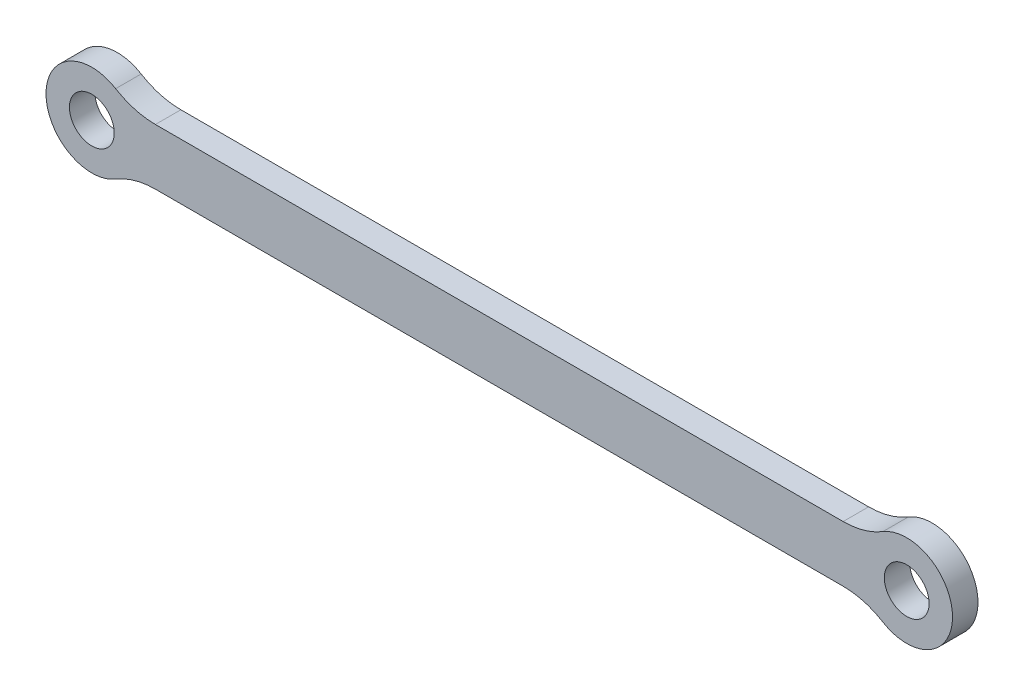
ISO-10303-21;
HEADER;
FILE_DESCRIPTION(('STEP AP214'),'2;1');
FILE_NAME('part.step','',(''),(''),'','','');
FILE_SCHEMA(('AUTOMOTIVE_DESIGN { 1 0 10303 214 1 1 1 1 }'));
ENDSEC;
DATA;
#1=APPLICATION_CONTEXT('core data for automotive mechanical design processes');
#2=APPLICATION_PROTOCOL_DEFINITION('international standard','automotive_design',2000,#1);
#3=PRODUCT_CONTEXT('',#1,'mechanical');
#4=PRODUCT('Part','Part','',(#3));
#5=PRODUCT_RELATED_PRODUCT_CATEGORY('part','',(#4));
#6=PRODUCT_DEFINITION_FORMATION('','',#4);
#7=PRODUCT_DEFINITION_CONTEXT('part definition',#1,'design');
#8=PRODUCT_DEFINITION('design','',#6,#7);
#9=PRODUCT_DEFINITION_SHAPE('','',#8);
#10=(LENGTH_UNIT() NAMED_UNIT(*) SI_UNIT(.MILLI.,.METRE.));
#11=(NAMED_UNIT(*) PLANE_ANGLE_UNIT() SI_UNIT($,.RADIAN.));
#12=(NAMED_UNIT(*) SI_UNIT($,.STERADIAN.) SOLID_ANGLE_UNIT());
#13=UNCERTAINTY_MEASURE_WITH_UNIT(LENGTH_MEASURE(1.E-05),#10,'distance_accuracy_value','');
#14=(GEOMETRIC_REPRESENTATION_CONTEXT(3) GLOBAL_UNCERTAINTY_ASSIGNED_CONTEXT((#13)) GLOBAL_UNIT_ASSIGNED_CONTEXT((#10,
#11,#12)) REPRESENTATION_CONTEXT('',''));
#15=CARTESIAN_POINT('',(0.,0.,0.));
#16=DIRECTION('',(0.,0.,1.));
#17=DIRECTION('',(1.,0.,0.));
#18=AXIS2_PLACEMENT_3D('',#15,#16,#17);
#19=CARTESIAN_POINT('',(-160.,0.,5.));
#20=DIRECTION('',(0.,0.,1.));
#21=DIRECTION('',(1.,0.,0.));
#22=AXIS2_PLACEMENT_3D('',#19,#20,#21);
#23=PLANE('',#22);
#24=CARTESIAN_POINT('',(0.,0.,5.));
#25=DIRECTION('',(0.,0.,-1.));
#26=DIRECTION('',(-1.,0.,0.));
#27=AXIS2_PLACEMENT_3D('',#24,#25,#26);
#28=CIRCLE('',#27,4.4);
#29=CARTESIAN_POINT('',(-4.4,0.,5.));
#30=VERTEX_POINT('',#29);
#31=EDGE_CURVE('E130',#30,#30,#28,.T.);
#32=ORIENTED_EDGE('',*,*,#31,.T.);
#33=EDGE_LOOP('',(#32));
#34=FACE_BOUND('',#33,.T.);
#35=CARTESIAN_POINT('',(0.,0.,5.));
#36=DIRECTION('',(0.,0.,-1.));
#37=DIRECTION('',(-1.,0.,0.));
#38=AXIS2_PLACEMENT_3D('',#35,#36,#37);
#39=CIRCLE('',#38,9.);
#40=CARTESIAN_POINT('',(-4.67999399038076,7.68749999999999,5.));
#41=VERTEX_POINT('',#40);
#42=CARTESIAN_POINT('',(-4.67999399038075,-7.68750000000001,5.));
#43=VERTEX_POINT('',#42);
#44=EDGE_CURVE('E137',#41,#43,#39,.T.);
#45=ORIENTED_EDGE('',*,*,#44,.F.);
#46=CARTESIAN_POINT('',(-12.4799839743487,20.5,5.));
#47=DIRECTION('',(0.,0.,-1.));
#48=DIRECTION('',(-1.,0.,0.));
#49=AXIS2_PLACEMENT_3D('',#46,#47,#48);
#50=CIRCLE('',#49,15.);
#51=CARTESIAN_POINT('',(-12.4799839743487,5.49999999999998,5.));
#52=VERTEX_POINT('',#51);
#53=EDGE_CURVE('E134',#41,#52,#50,.T.);
#54=ORIENTED_EDGE('',*,*,#53,.T.);
#55=DIRECTION('',(1.,0.,0.));
#56=VECTOR('',#55,1.);
#57=CARTESIAN_POINT('',(-152.876096575612,5.49999999999998,5.));
#58=LINE('',#57,#56);
#59=CARTESIAN_POINT('',(-147.520016025651,5.49999999999999,5.));
#60=VERTEX_POINT('',#59);
#61=EDGE_CURVE('E104',#52,#60,#58,.F.);
#62=ORIENTED_EDGE('',*,*,#61,.T.);
#63=CARTESIAN_POINT('',(-147.520016025651,20.5,5.));
#64=DIRECTION('',(0.,0.,-1.));
#65=DIRECTION('',(-1.,0.,0.));
#66=AXIS2_PLACEMENT_3D('',#63,#64,#65);
#67=CIRCLE('',#66,15.);
#68=CARTESIAN_POINT('',(-155.320006009619,7.68749999999999,5.));
#69=VERTEX_POINT('',#68);
#70=EDGE_CURVE('E86',#60,#69,#67,.T.);
#71=ORIENTED_EDGE('',*,*,#70,.T.);
#72=CARTESIAN_POINT('',(-160.,0.,5.));
#73=DIRECTION('',(0.,0.,-1.));
#74=DIRECTION('',(-1.,0.,0.));
#75=AXIS2_PLACEMENT_3D('',#72,#73,#74);
#76=CIRCLE('',#75,9.00000000000001);
#77=CARTESIAN_POINT('',(-155.320006009619,-7.68750000000001,5.));
#78=VERTEX_POINT('',#77);
#79=EDGE_CURVE('E83',#78,#69,#76,.T.);
#80=ORIENTED_EDGE('',*,*,#79,.F.);
#81=CARTESIAN_POINT('',(-147.520016025651,-20.5,5.));
#82=DIRECTION('',(0.,0.,-1.));
#83=DIRECTION('',(-1.,0.,0.));
#84=AXIS2_PLACEMENT_3D('',#81,#82,#83);
#85=CIRCLE('',#84,15.);
#86=CARTESIAN_POINT('',(-147.520016025651,-5.50000000000002,5.));
#87=VERTEX_POINT('',#86);
#88=EDGE_CURVE('E80',#78,#87,#85,.T.);
#89=ORIENTED_EDGE('',*,*,#88,.T.);
#90=DIRECTION('',(1.,0.,0.));
#91=VECTOR('',#90,1.);
#92=CARTESIAN_POINT('',(-152.876096575612,-5.50000000000002,5.));
#93=LINE('',#92,#91);
#94=CARTESIAN_POINT('',(-12.4799839743487,-5.50000000000002,5.));
#95=VERTEX_POINT('',#94);
#96=EDGE_CURVE('E108',#87,#95,#93,.T.);
#97=ORIENTED_EDGE('',*,*,#96,.T.);
#98=CARTESIAN_POINT('',(-12.4799839743487,-20.5,5.));
#99=DIRECTION('',(0.,0.,-1.));
#100=DIRECTION('',(-1.,0.,0.));
#101=AXIS2_PLACEMENT_3D('',#98,#99,#100);
#102=CIRCLE('',#101,15.);
#103=EDGE_CURVE('E140',#95,#43,#102,.T.);
#104=ORIENTED_EDGE('',*,*,#103,.T.);
#105=EDGE_LOOP('',(#45,#54,#62,#71,#80,#89,#97,#104));
#106=FACE_BOUND('',#105,.T.);
#107=CARTESIAN_POINT('',(-160.,0.,5.));
#108=DIRECTION('',(0.,0.,-1.));
#109=DIRECTION('',(-1.,0.,0.));
#110=AXIS2_PLACEMENT_3D('',#107,#108,#109);
#111=CIRCLE('',#110,4.39999999999999);
#112=CARTESIAN_POINT('',(-164.4,0.,5.));
#113=VERTEX_POINT('',#112);
#114=EDGE_CURVE('E20',#113,#113,#111,.T.);
#115=ORIENTED_EDGE('',*,*,#114,.T.);
#116=EDGE_LOOP('',(#115));
#117=FACE_BOUND('',#116,.T.);
#118=ADVANCED_FACE('F17',(#34,#106,#117),#23,.T.);
#119=CARTESIAN_POINT('',(-160.,0.,5.));
#120=DIRECTION('',(0.,0.,-1.));
#121=DIRECTION('',(-1.,0.,0.));
#122=AXIS2_PLACEMENT_3D('',#119,#120,#121);
#123=CYLINDRICAL_SURFACE('',#122,4.39999999999999);
#124=CARTESIAN_POINT('',(-160.,0.,0.));
#125=DIRECTION('',(0.,0.,-1.));
#126=DIRECTION('',(-1.,0.,0.));
#127=AXIS2_PLACEMENT_3D('',#124,#125,#126);
#128=CIRCLE('',#127,4.39999999999999);
#129=CARTESIAN_POINT('',(-164.4,0.,0.));
#130=VERTEX_POINT('',#129);
#131=EDGE_CURVE('E127',#130,#130,#128,.T.);
#132=ORIENTED_EDGE('',*,*,#131,.T.);
#133=EDGE_LOOP('',(#132));
#134=FACE_BOUND('',#133,.T.);
#135=ORIENTED_EDGE('',*,*,#114,.F.);
#136=EDGE_LOOP('',(#135));
#137=FACE_BOUND('',#136,.T.);
#138=ADVANCED_FACE('F267',(#134,#137),#123,.F.);
#139=CARTESIAN_POINT('',(-147.520016025651,-20.5,5.));
#140=DIRECTION('',(0.,0.,-1.));
#141=DIRECTION('',(-1.,0.,0.));
#142=AXIS2_PLACEMENT_3D('',#139,#140,#141);
#143=CYLINDRICAL_SURFACE('',#142,15.);
#144=DIRECTION('',(0.,0.,-1.));
#145=VECTOR('',#144,1.);
#146=CARTESIAN_POINT('',(-155.320006009619,-7.68749999999999,5.));
#147=LINE('',#146,#145);
#148=CARTESIAN_POINT('',(-155.320006009619,-7.6875,0.));
#149=VERTEX_POINT('',#148);
#150=EDGE_CURVE('E96',#149,#78,#147,.F.);
#151=ORIENTED_EDGE('',*,*,#150,.F.);
#152=CARTESIAN_POINT('',(-147.520016025651,-20.5,0.));
#153=DIRECTION('',(0.,0.,-1.));
#154=DIRECTION('',(-1.,0.,0.));
#155=AXIS2_PLACEMENT_3D('',#152,#153,#154);
#156=CIRCLE('',#155,15.);
#157=CARTESIAN_POINT('',(-147.520016025651,-5.50000000000002,0.));
#158=VERTEX_POINT('',#157);
#159=EDGE_CURVE('E124',#149,#158,#156,.T.);
#160=ORIENTED_EDGE('',*,*,#159,.T.);
#161=DIRECTION('',(0.,0.,1.));
#162=VECTOR('',#161,1.);
#163=CARTESIAN_POINT('',(-147.520016025651,-5.50000000000002,5.));
#164=LINE('',#163,#162);
#165=EDGE_CURVE('E97',#158,#87,#164,.T.);
#166=ORIENTED_EDGE('',*,*,#165,.T.);
#167=ORIENTED_EDGE('',*,*,#88,.F.);
#168=EDGE_LOOP('',(#151,#160,#166,#167));
#169=FACE_BOUND('',#168,.T.);
#170=ADVANCED_FACE('F94',(#169),#143,.F.);
#171=CARTESIAN_POINT('',(-152.876096575612,-5.50000000000002,5.));
#172=DIRECTION('',(0.,1.,0.));
#173=DIRECTION('',(0.,0.,1.));
#174=AXIS2_PLACEMENT_3D('',#171,#172,#173);
#175=PLANE('',#174);
#176=ORIENTED_EDGE('',*,*,#165,.F.);
#177=DIRECTION('',(1.,0.,0.));
#178=VECTOR('',#177,1.);
#179=CARTESIAN_POINT('',(-160.,-5.50000000000002,0.));
#180=LINE('',#179,#178);
#181=CARTESIAN_POINT('',(-12.4799839743487,-5.50000000000002,0.));
#182=VERTEX_POINT('',#181);
#183=EDGE_CURVE('E123',#158,#182,#180,.T.);
#184=ORIENTED_EDGE('',*,*,#183,.T.);
#185=DIRECTION('',(0.,0.,-1.));
#186=VECTOR('',#185,1.);
#187=CARTESIAN_POINT('',(-12.4799839743487,-5.50000000000002,5.));
#188=LINE('',#187,#186);
#189=EDGE_CURVE('E109',#182,#95,#188,.F.);
#190=ORIENTED_EDGE('',*,*,#189,.T.);
#191=ORIENTED_EDGE('',*,*,#96,.F.);
#192=EDGE_LOOP('',(#176,#184,#190,#191));
#193=FACE_BOUND('',#192,.T.);
#194=ADVANCED_FACE('F176',(#193),#175,.F.);
#195=CARTESIAN_POINT('',(-12.4799839743487,-20.5,5.));
#196=DIRECTION('',(0.,0.,-1.));
#197=DIRECTION('',(-1.,0.,0.));
#198=AXIS2_PLACEMENT_3D('',#195,#196,#197);
#199=CYLINDRICAL_SURFACE('',#198,15.);
#200=ORIENTED_EDGE('',*,*,#189,.F.);
#201=CARTESIAN_POINT('',(-12.4799839743487,-20.5,0.));
#202=DIRECTION('',(0.,0.,-1.));
#203=DIRECTION('',(-1.,0.,0.));
#204=AXIS2_PLACEMENT_3D('',#201,#202,#203);
#205=CIRCLE('',#204,15.);
#206=CARTESIAN_POINT('',(-4.67999399038075,-7.68750000000001,0.));
#207=VERTEX_POINT('',#206);
#208=EDGE_CURVE('E120',#182,#207,#205,.T.);
#209=ORIENTED_EDGE('',*,*,#208,.T.);
#210=DIRECTION('',(0.,0.,-1.));
#211=VECTOR('',#210,1.);
#212=CARTESIAN_POINT('',(-4.67999399038075,-7.68750000000001,5.));
#213=LINE('',#212,#211);
#214=EDGE_CURVE('E139',#43,#207,#213,.T.);
#215=ORIENTED_EDGE('',*,*,#214,.F.);
#216=ORIENTED_EDGE('',*,*,#103,.F.);
#217=EDGE_LOOP('',(#200,#209,#215,#216));
#218=FACE_BOUND('',#217,.T.);
#219=ADVANCED_FACE('F174',(#218),#199,.F.);
#220=CARTESIAN_POINT('',(0.,0.,5.));
#221=DIRECTION('',(0.,0.,-1.));
#222=DIRECTION('',(-1.,0.,0.));
#223=AXIS2_PLACEMENT_3D('',#220,#221,#222);
#224=CYLINDRICAL_SURFACE('',#223,9.);
#225=CARTESIAN_POINT('',(0.,0.,0.));
#226=DIRECTION('',(0.,0.,-1.));
#227=DIRECTION('',(-1.,0.,0.));
#228=AXIS2_PLACEMENT_3D('',#225,#226,#227);
#229=CIRCLE('',#228,9.);
#230=CARTESIAN_POINT('',(-4.67999399038076,7.68749999999999,0.));
#231=VERTEX_POINT('',#230);
#232=EDGE_CURVE('E117',#207,#231,#229,.F.);
#233=ORIENTED_EDGE('',*,*,#232,.T.);
#234=DIRECTION('',(0.,0.,-1.));
#235=VECTOR('',#234,1.);
#236=CARTESIAN_POINT('',(-4.67999399038076,7.6875,5.));
#237=LINE('',#236,#235);
#238=EDGE_CURVE('E136',#231,#41,#237,.F.);
#239=ORIENTED_EDGE('',*,*,#238,.T.);
#240=ORIENTED_EDGE('',*,*,#44,.T.);
#241=ORIENTED_EDGE('',*,*,#214,.T.);
#242=EDGE_LOOP('',(#233,#239,#240,#241));
#243=FACE_BOUND('',#242,.T.);
#244=ADVANCED_FACE('F170',(#243),#224,.T.);
#245=CARTESIAN_POINT('',(-12.4799839743487,20.5,5.));
#246=DIRECTION('',(0.,0.,-1.));
#247=DIRECTION('',(-1.,0.,0.));
#248=AXIS2_PLACEMENT_3D('',#245,#246,#247);
#249=CYLINDRICAL_SURFACE('',#248,15.);
#250=ORIENTED_EDGE('',*,*,#238,.F.);
#251=CARTESIAN_POINT('',(-12.4799839743487,20.5,0.));
#252=DIRECTION('',(0.,0.,-1.));
#253=DIRECTION('',(-1.,0.,0.));
#254=AXIS2_PLACEMENT_3D('',#251,#252,#253);
#255=CIRCLE('',#254,15.);
#256=CARTESIAN_POINT('',(-12.4799839743487,5.49999999999998,0.));
#257=VERTEX_POINT('',#256);
#258=EDGE_CURVE('E114',#231,#257,#255,.T.);
#259=ORIENTED_EDGE('',*,*,#258,.T.);
#260=DIRECTION('',(0.,0.,-1.));
#261=VECTOR('',#260,1.);
#262=CARTESIAN_POINT('',(-12.4799839743487,5.49999999999998,5.));
#263=LINE('',#262,#261);
#264=EDGE_CURVE('E107',#257,#52,#263,.F.);
#265=ORIENTED_EDGE('',*,*,#264,.T.);
#266=ORIENTED_EDGE('',*,*,#53,.F.);
#267=EDGE_LOOP('',(#250,#259,#265,#266));
#268=FACE_BOUND('',#267,.T.);
#269=ADVANCED_FACE('F167',(#268),#249,.F.);
#270=CARTESIAN_POINT('',(-152.876096575612,5.49999999999998,5.));
#271=DIRECTION('',(0.,-1.,0.));
#272=DIRECTION('',(0.,0.,-1.));
#273=AXIS2_PLACEMENT_3D('',#270,#271,#272);
#274=PLANE('',#273);
#275=DIRECTION('',(0.,0.,-1.));
#276=VECTOR('',#275,1.);
#277=CARTESIAN_POINT('',(-147.520016025651,5.49999999999999,5.));
#278=LINE('',#277,#276);
#279=CARTESIAN_POINT('',(-147.520016025651,5.49999999999999,0.));
#280=VERTEX_POINT('',#279);
#281=EDGE_CURVE('E106',#280,#60,#278,.F.);
#282=ORIENTED_EDGE('',*,*,#281,.T.);
#283=ORIENTED_EDGE('',*,*,#61,.F.);
#284=ORIENTED_EDGE('',*,*,#264,.F.);
#285=DIRECTION('',(1.,0.,0.));
#286=VECTOR('',#285,1.);
#287=CARTESIAN_POINT('',(-160.,5.49999999999998,0.));
#288=LINE('',#287,#286);
#289=EDGE_CURVE('E113',#257,#280,#288,.F.);
#290=ORIENTED_EDGE('',*,*,#289,.T.);
#291=EDGE_LOOP('',(#282,#283,#284,#290));
#292=FACE_BOUND('',#291,.T.);
#293=ADVANCED_FACE('F160',(#292),#274,.F.);
#294=CARTESIAN_POINT('',(-147.520016025651,20.5,5.));
#295=DIRECTION('',(0.,0.,-1.));
#296=DIRECTION('',(-1.,0.,0.));
#297=AXIS2_PLACEMENT_3D('',#294,#295,#296);
#298=CYLINDRICAL_SURFACE('',#297,15.);
#299=ORIENTED_EDGE('',*,*,#281,.F.);
#300=CARTESIAN_POINT('',(-147.520016025651,20.5,0.));
#301=DIRECTION('',(0.,0.,-1.));
#302=DIRECTION('',(-1.,0.,0.));
#303=AXIS2_PLACEMENT_3D('',#300,#301,#302);
#304=CIRCLE('',#303,15.);
#305=CARTESIAN_POINT('',(-155.320006009619,7.68749999999999,0.));
#306=VERTEX_POINT('',#305);
#307=EDGE_CURVE('E26',#280,#306,#304,.T.);
#308=ORIENTED_EDGE('',*,*,#307,.T.);
#309=DIRECTION('',(0.,0.,-1.));
#310=VECTOR('',#309,1.);
#311=CARTESIAN_POINT('',(-155.320006009619,7.68749999999998,5.));
#312=LINE('',#311,#310);
#313=EDGE_CURVE('E90',#69,#306,#312,.T.);
#314=ORIENTED_EDGE('',*,*,#313,.F.);
#315=ORIENTED_EDGE('',*,*,#70,.F.);
#316=EDGE_LOOP('',(#299,#308,#314,#315));
#317=FACE_BOUND('',#316,.T.);
#318=ADVANCED_FACE('F198',(#317),#298,.F.);
#319=CARTESIAN_POINT('',(-160.,0.,5.));
#320=DIRECTION('',(0.,0.,-1.));
#321=DIRECTION('',(-1.,0.,0.));
#322=AXIS2_PLACEMENT_3D('',#319,#320,#321);
#323=CYLINDRICAL_SURFACE('',#322,9.00000000000001);
#324=ORIENTED_EDGE('',*,*,#313,.T.);
#325=CARTESIAN_POINT('',(-160.,0.,0.));
#326=DIRECTION('',(0.,0.,-1.));
#327=DIRECTION('',(-1.,0.,0.));
#328=AXIS2_PLACEMENT_3D('',#325,#326,#327);
#329=CIRCLE('',#328,9.00000000000001);
#330=EDGE_CURVE('E35',#306,#149,#329,.F.);
#331=ORIENTED_EDGE('',*,*,#330,.T.);
#332=ORIENTED_EDGE('',*,*,#150,.T.);
#333=ORIENTED_EDGE('',*,*,#79,.T.);
#334=EDGE_LOOP('',(#324,#331,#332,#333));
#335=FACE_BOUND('',#334,.T.);
#336=ADVANCED_FACE('F98',(#335),#323,.T.);
#337=CARTESIAN_POINT('',(0.,0.,5.));
#338=DIRECTION('',(0.,0.,-1.));
#339=DIRECTION('',(-1.,0.,0.));
#340=AXIS2_PLACEMENT_3D('',#337,#338,#339);
#341=CYLINDRICAL_SURFACE('',#340,4.4);
#342=CARTESIAN_POINT('',(0.,0.,0.));
#343=DIRECTION('',(0.,0.,-1.));
#344=DIRECTION('',(-1.,0.,0.));
#345=AXIS2_PLACEMENT_3D('',#342,#343,#344);
#346=CIRCLE('',#345,4.4);
#347=CARTESIAN_POINT('',(-4.4,0.,0.));
#348=VERTEX_POINT('',#347);
#349=EDGE_CURVE('E11',#348,#348,#346,.T.);
#350=ORIENTED_EDGE('',*,*,#349,.T.);
#351=EDGE_LOOP('',(#350));
#352=FACE_BOUND('',#351,.T.);
#353=ORIENTED_EDGE('',*,*,#31,.F.);
#354=EDGE_LOOP('',(#353));
#355=FACE_BOUND('',#354,.T.);
#356=ADVANCED_FACE('F186',(#352,#355),#341,.F.);
#357=CARTESIAN_POINT('',(-160.,0.,0.));
#358=DIRECTION('',(0.,0.,1.));
#359=DIRECTION('',(1.,0.,0.));
#360=AXIS2_PLACEMENT_3D('',#357,#358,#359);
#361=PLANE('',#360);
#362=ORIENTED_EDGE('',*,*,#349,.F.);
#363=EDGE_LOOP('',(#362));
#364=FACE_BOUND('',#363,.T.);
#365=ORIENTED_EDGE('',*,*,#307,.F.);
#366=ORIENTED_EDGE('',*,*,#289,.F.);
#367=ORIENTED_EDGE('',*,*,#258,.F.);
#368=ORIENTED_EDGE('',*,*,#232,.F.);
#369=ORIENTED_EDGE('',*,*,#208,.F.);
#370=ORIENTED_EDGE('',*,*,#183,.F.);
#371=ORIENTED_EDGE('',*,*,#159,.F.);
#372=ORIENTED_EDGE('',*,*,#330,.F.);
#373=EDGE_LOOP('',(#365,#366,#367,#368,#369,#370,#371,#372));
#374=FACE_BOUND('',#373,.T.);
#375=ORIENTED_EDGE('',*,*,#131,.F.);
#376=EDGE_LOOP('',(#375));
#377=FACE_BOUND('',#376,.T.);
#378=ADVANCED_FACE('F163',(#364,#374,#377),#361,.F.);
#379=CLOSED_SHELL('',(#118,#138,#170,#194,#219,#244,#269,#293,#318,#336,#356,#378));
#380=MANIFOLD_SOLID_BREP('B1',#379);
#381=ADVANCED_BREP_SHAPE_REPRESENTATION('',(#18,#380),#14);
#382=SHAPE_DEFINITION_REPRESENTATION(#9,#381);
ENDSEC;
END-ISO-10303-21;
